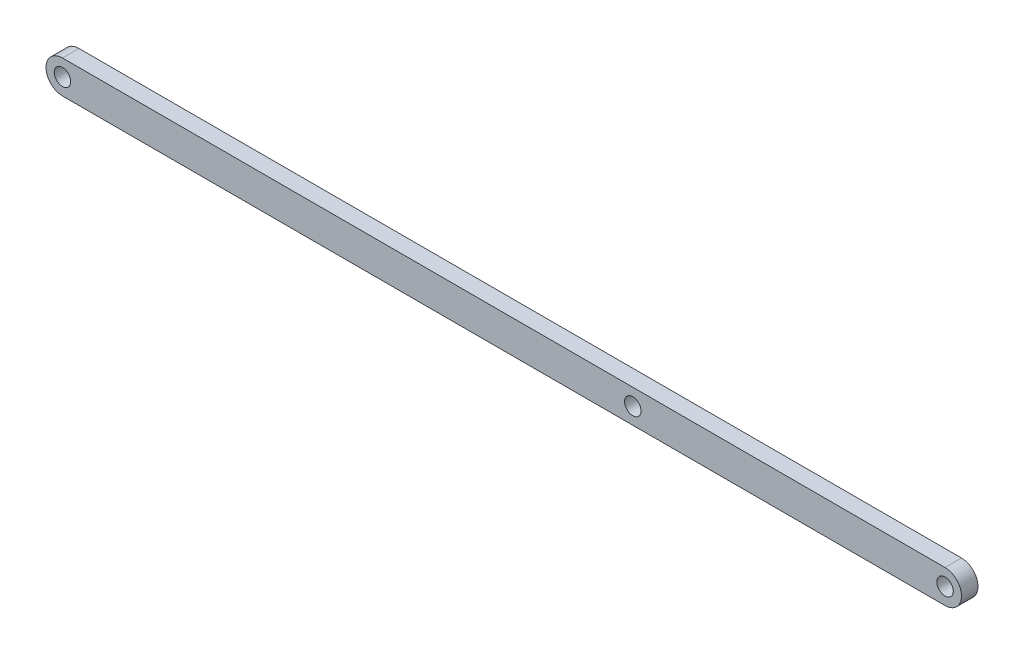
ISO-10303-21;
HEADER;
FILE_DESCRIPTION(('STEP AP214'),'2;1');
FILE_NAME('part.step','',(''),(''),'','','');
FILE_SCHEMA(('AUTOMOTIVE_DESIGN { 1 0 10303 214 1 1 1 1 }'));
ENDSEC;
DATA;
#1=APPLICATION_CONTEXT('core data for automotive mechanical design processes');
#2=APPLICATION_PROTOCOL_DEFINITION('international standard','automotive_design',2000,#1);
#3=PRODUCT_CONTEXT('',#1,'mechanical');
#4=PRODUCT('Part','Part','',(#3));
#5=PRODUCT_RELATED_PRODUCT_CATEGORY('part','',(#4));
#6=PRODUCT_DEFINITION_FORMATION('','',#4);
#7=PRODUCT_DEFINITION_CONTEXT('part definition',#1,'design');
#8=PRODUCT_DEFINITION('design','',#6,#7);
#9=PRODUCT_DEFINITION_SHAPE('','',#8);
#10=(LENGTH_UNIT() NAMED_UNIT(*) SI_UNIT(.MILLI.,.METRE.));
#11=(NAMED_UNIT(*) PLANE_ANGLE_UNIT() SI_UNIT($,.RADIAN.));
#12=(NAMED_UNIT(*) SI_UNIT($,.STERADIAN.) SOLID_ANGLE_UNIT());
#13=UNCERTAINTY_MEASURE_WITH_UNIT(LENGTH_MEASURE(1.E-05),#10,'distance_accuracy_value','');
#14=(GEOMETRIC_REPRESENTATION_CONTEXT(3) GLOBAL_UNCERTAINTY_ASSIGNED_CONTEXT((#13)) GLOBAL_UNIT_ASSIGNED_CONTEXT((#10,
#11,#12)) REPRESENTATION_CONTEXT('',''));
#15=CARTESIAN_POINT('',(0.,0.,0.));
#16=DIRECTION('',(0.,0.,1.));
#17=DIRECTION('',(1.,0.,0.));
#18=AXIS2_PLACEMENT_3D('',#15,#16,#17);
#19=CARTESIAN_POINT('',(40.72,0.,5.));
#20=DIRECTION('',(0.,0.,-1.));
#21=DIRECTION('',(-1.,0.,0.));
#22=AXIS2_PLACEMENT_3D('',#19,#20,#21);
#23=PLANE('',#22);
#24=CARTESIAN_POINT('',(40.72,0.,5.));
#25=DIRECTION('',(0.,0.,1.));
#26=DIRECTION('',(-1.,0.,0.));
#27=AXIS2_PLACEMENT_3D('',#24,#25,#26);
#28=CIRCLE('',#27,5.);
#29=CARTESIAN_POINT('',(40.72,-5.,5.));
#30=VERTEX_POINT('',#29);
#31=CARTESIAN_POINT('',(40.72,5.,5.));
#32=VERTEX_POINT('',#31);
#33=EDGE_CURVE('E96',#30,#32,#28,.T.);
#34=ORIENTED_EDGE('',*,*,#33,.T.);
#35=DIRECTION('',(-1.,0.,0.));
#36=VECTOR('',#35,1.);
#37=CARTESIAN_POINT('',(-227.28,5.,5.));
#38=LINE('',#37,#36);
#39=CARTESIAN_POINT('',(-227.28,5.,5.));
#40=VERTEX_POINT('',#39);
#41=EDGE_CURVE('E91',#32,#40,#38,.T.);
#42=ORIENTED_EDGE('',*,*,#41,.T.);
#43=CARTESIAN_POINT('',(-227.28,0.,5.));
#44=DIRECTION('',(0.,0.,1.));
#45=DIRECTION('',(1.,0.,0.));
#46=AXIS2_PLACEMENT_3D('',#43,#44,#45);
#47=CIRCLE('',#46,5.);
#48=CARTESIAN_POINT('',(-227.28,-5.,5.));
#49=VERTEX_POINT('',#48);
#50=EDGE_CURVE('E94',#40,#49,#47,.T.);
#51=ORIENTED_EDGE('',*,*,#50,.T.);
#52=DIRECTION('',(1.,0.,0.));
#53=VECTOR('',#52,1.);
#54=CARTESIAN_POINT('',(-227.28,-5.,5.));
#55=LINE('',#54,#53);
#56=EDGE_CURVE('E61',#49,#30,#55,.T.);
#57=ORIENTED_EDGE('',*,*,#56,.T.);
#58=EDGE_LOOP('',(#34,#42,#51,#57));
#59=FACE_BOUND('',#58,.T.);
#60=CARTESIAN_POINT('',(-54.1,0.,5.));
#61=DIRECTION('',(0.,0.,1.));
#62=DIRECTION('',(1.,0.,0.));
#63=AXIS2_PLACEMENT_3D('',#60,#61,#62);
#64=CIRCLE('',#63,2.5);
#65=CARTESIAN_POINT('',(-51.6,0.,5.));
#66=VERTEX_POINT('',#65);
#67=EDGE_CURVE('E116',#66,#66,#64,.T.);
#68=ORIENTED_EDGE('',*,*,#67,.F.);
#69=EDGE_LOOP('',(#68));
#70=FACE_BOUND('',#69,.T.);
#71=CARTESIAN_POINT('',(-227.28,0.,5.));
#72=DIRECTION('',(0.,0.,1.));
#73=DIRECTION('',(1.,0.,0.));
#74=AXIS2_PLACEMENT_3D('',#71,#72,#73);
#75=CIRCLE('',#74,2.5);
#76=CARTESIAN_POINT('',(-224.78,0.,5.));
#77=VERTEX_POINT('',#76);
#78=EDGE_CURVE('E138',#77,#77,#75,.T.);
#79=ORIENTED_EDGE('',*,*,#78,.F.);
#80=EDGE_LOOP('',(#79));
#81=FACE_BOUND('',#80,.T.);
#82=CARTESIAN_POINT('',(40.72,0.,5.));
#83=DIRECTION('',(0.,0.,1.));
#84=DIRECTION('',(1.,0.,0.));
#85=AXIS2_PLACEMENT_3D('',#82,#83,#84);
#86=CIRCLE('',#85,2.49999999999999);
#87=CARTESIAN_POINT('',(43.22,0.,5.));
#88=VERTEX_POINT('',#87);
#89=EDGE_CURVE('E146',#88,#88,#86,.T.);
#90=ORIENTED_EDGE('',*,*,#89,.F.);
#91=EDGE_LOOP('',(#90));
#92=FACE_BOUND('',#91,.T.);
#93=ADVANCED_FACE('F43',(#59,#70,#81,#92),#23,.F.);
#94=CARTESIAN_POINT('',(40.72,0.,0.));
#95=DIRECTION('',(0.,0.,-1.));
#96=DIRECTION('',(-1.,0.,0.));
#97=AXIS2_PLACEMENT_3D('',#94,#95,#96);
#98=PLANE('',#97);
#99=CARTESIAN_POINT('',(-227.28,0.,0.));
#100=DIRECTION('',(0.,0.,1.));
#101=DIRECTION('',(1.,0.,0.));
#102=AXIS2_PLACEMENT_3D('',#99,#100,#101);
#103=CIRCLE('',#102,2.5);
#104=CARTESIAN_POINT('',(-224.78,0.,0.));
#105=VERTEX_POINT('',#104);
#106=EDGE_CURVE('E142',#105,#105,#103,.T.);
#107=ORIENTED_EDGE('',*,*,#106,.T.);
#108=EDGE_LOOP('',(#107));
#109=FACE_BOUND('',#108,.T.);
#110=CARTESIAN_POINT('',(40.72,0.,0.));
#111=DIRECTION('',(0.,0.,1.));
#112=DIRECTION('',(-1.,0.,0.));
#113=AXIS2_PLACEMENT_3D('',#110,#111,#112);
#114=CIRCLE('',#113,5.);
#115=CARTESIAN_POINT('',(40.72,-5.,0.));
#116=VERTEX_POINT('',#115);
#117=CARTESIAN_POINT('',(40.72,5.,0.));
#118=VERTEX_POINT('',#117);
#119=EDGE_CURVE('E112',#116,#118,#114,.T.);
#120=ORIENTED_EDGE('',*,*,#119,.F.);
#121=DIRECTION('',(1.,0.,0.));
#122=VECTOR('',#121,1.);
#123=CARTESIAN_POINT('',(-227.28,-5.,0.));
#124=LINE('',#123,#122);
#125=CARTESIAN_POINT('',(-227.28,-5.,0.));
#126=VERTEX_POINT('',#125);
#127=EDGE_CURVE('E84',#126,#116,#124,.T.);
#128=ORIENTED_EDGE('',*,*,#127,.F.);
#129=CARTESIAN_POINT('',(-227.28,0.,0.));
#130=DIRECTION('',(0.,0.,1.));
#131=DIRECTION('',(1.,0.,0.));
#132=AXIS2_PLACEMENT_3D('',#129,#130,#131);
#133=CIRCLE('',#132,5.);
#134=CARTESIAN_POINT('',(-227.28,5.,0.));
#135=VERTEX_POINT('',#134);
#136=EDGE_CURVE('E78',#135,#126,#133,.T.);
#137=ORIENTED_EDGE('',*,*,#136,.F.);
#138=DIRECTION('',(-1.,0.,0.));
#139=VECTOR('',#138,1.);
#140=CARTESIAN_POINT('',(-227.28,5.,0.));
#141=LINE('',#140,#139);
#142=EDGE_CURVE('E101',#118,#135,#141,.T.);
#143=ORIENTED_EDGE('',*,*,#142,.F.);
#144=EDGE_LOOP('',(#120,#128,#137,#143));
#145=FACE_BOUND('',#144,.T.);
#146=CARTESIAN_POINT('',(-54.1,0.,0.));
#147=DIRECTION('',(0.,0.,1.));
#148=DIRECTION('',(1.,0.,0.));
#149=AXIS2_PLACEMENT_3D('',#146,#147,#148);
#150=CIRCLE('',#149,2.5);
#151=CARTESIAN_POINT('',(-51.6,0.,0.));
#152=VERTEX_POINT('',#151);
#153=EDGE_CURVE('E134',#152,#152,#150,.T.);
#154=ORIENTED_EDGE('',*,*,#153,.T.);
#155=EDGE_LOOP('',(#154));
#156=FACE_BOUND('',#155,.T.);
#157=CARTESIAN_POINT('',(40.72,0.,0.));
#158=DIRECTION('',(0.,0.,1.));
#159=DIRECTION('',(1.,0.,0.));
#160=AXIS2_PLACEMENT_3D('',#157,#158,#159);
#161=CIRCLE('',#160,2.49999999999999);
#162=CARTESIAN_POINT('',(43.22,0.,0.));
#163=VERTEX_POINT('',#162);
#164=EDGE_CURVE('E150',#163,#163,#161,.T.);
#165=ORIENTED_EDGE('',*,*,#164,.T.);
#166=EDGE_LOOP('',(#165));
#167=FACE_BOUND('',#166,.T.);
#168=ADVANCED_FACE('F129',(#109,#145,#156,#167),#98,.T.);
#169=CARTESIAN_POINT('',(40.72,0.,5.));
#170=DIRECTION('',(0.,0.,-1.));
#171=DIRECTION('',(-1.,0.,0.));
#172=AXIS2_PLACEMENT_3D('',#169,#170,#171);
#173=CYLINDRICAL_SURFACE('',#172,5.);
#174=ORIENTED_EDGE('',*,*,#119,.T.);
#175=DIRECTION('',(0.,0.,-1.));
#176=VECTOR('',#175,1.);
#177=CARTESIAN_POINT('',(40.72,5.,5.));
#178=LINE('',#177,#176);
#179=EDGE_CURVE('E11',#32,#118,#178,.T.);
#180=ORIENTED_EDGE('',*,*,#179,.F.);
#181=ORIENTED_EDGE('',*,*,#33,.F.);
#182=DIRECTION('',(0.,0.,-1.));
#183=VECTOR('',#182,1.);
#184=CARTESIAN_POINT('',(40.72,-5.,5.));
#185=LINE('',#184,#183);
#186=EDGE_CURVE('E108',#30,#116,#185,.T.);
#187=ORIENTED_EDGE('',*,*,#186,.T.);
#188=EDGE_LOOP('',(#174,#180,#181,#187));
#189=FACE_BOUND('',#188,.T.);
#190=ADVANCED_FACE('F45',(#189),#173,.T.);
#191=CARTESIAN_POINT('',(-227.28,5.,5.));
#192=DIRECTION('',(0.,-1.,0.));
#193=DIRECTION('',(0.,0.,-1.));
#194=AXIS2_PLACEMENT_3D('',#191,#192,#193);
#195=PLANE('',#194);
#196=ORIENTED_EDGE('',*,*,#142,.T.);
#197=DIRECTION('',(0.,0.,-1.));
#198=VECTOR('',#197,1.);
#199=CARTESIAN_POINT('',(-227.28,5.,5.));
#200=LINE('',#199,#198);
#201=EDGE_CURVE('E53',#40,#135,#200,.T.);
#202=ORIENTED_EDGE('',*,*,#201,.F.);
#203=ORIENTED_EDGE('',*,*,#41,.F.);
#204=ORIENTED_EDGE('',*,*,#179,.T.);
#205=EDGE_LOOP('',(#196,#202,#203,#204));
#206=FACE_BOUND('',#205,.T.);
#207=ADVANCED_FACE('F100',(#206),#195,.F.);
#208=CARTESIAN_POINT('',(-227.28,0.,5.));
#209=DIRECTION('',(0.,0.,-1.));
#210=DIRECTION('',(-1.,0.,0.));
#211=AXIS2_PLACEMENT_3D('',#208,#209,#210);
#212=CYLINDRICAL_SURFACE('',#211,5.);
#213=ORIENTED_EDGE('',*,*,#136,.T.);
#214=DIRECTION('',(0.,0.,-1.));
#215=VECTOR('',#214,1.);
#216=CARTESIAN_POINT('',(-227.28,-5.,5.));
#217=LINE('',#216,#215);
#218=EDGE_CURVE('E103',#49,#126,#217,.T.);
#219=ORIENTED_EDGE('',*,*,#218,.F.);
#220=ORIENTED_EDGE('',*,*,#50,.F.);
#221=ORIENTED_EDGE('',*,*,#201,.T.);
#222=EDGE_LOOP('',(#213,#219,#220,#221));
#223=FACE_BOUND('',#222,.T.);
#224=ADVANCED_FACE('F104',(#223),#212,.T.);
#225=CARTESIAN_POINT('',(-227.28,-5.,5.));
#226=DIRECTION('',(0.,1.,0.));
#227=DIRECTION('',(0.,0.,1.));
#228=AXIS2_PLACEMENT_3D('',#225,#226,#227);
#229=PLANE('',#228);
#230=ORIENTED_EDGE('',*,*,#127,.T.);
#231=ORIENTED_EDGE('',*,*,#186,.F.);
#232=ORIENTED_EDGE('',*,*,#56,.F.);
#233=ORIENTED_EDGE('',*,*,#218,.T.);
#234=EDGE_LOOP('',(#230,#231,#232,#233));
#235=FACE_BOUND('',#234,.T.);
#236=ADVANCED_FACE('F126',(#235),#229,.F.);
#237=CARTESIAN_POINT('',(-54.1,0.,5.));
#238=DIRECTION('',(0.,0.,-1.));
#239=DIRECTION('',(-1.,0.,0.));
#240=AXIS2_PLACEMENT_3D('',#237,#238,#239);
#241=CYLINDRICAL_SURFACE('',#240,2.5);
#242=ORIENTED_EDGE('',*,*,#67,.T.);
#243=EDGE_LOOP('',(#242));
#244=FACE_BOUND('',#243,.T.);
#245=ORIENTED_EDGE('',*,*,#153,.F.);
#246=EDGE_LOOP('',(#245));
#247=FACE_BOUND('',#246,.T.);
#248=ADVANCED_FACE('F169',(#244,#247),#241,.F.);
#249=CARTESIAN_POINT('',(-227.28,0.,5.));
#250=DIRECTION('',(0.,0.,-1.));
#251=DIRECTION('',(-1.,0.,0.));
#252=AXIS2_PLACEMENT_3D('',#249,#250,#251);
#253=CYLINDRICAL_SURFACE('',#252,2.5);
#254=ORIENTED_EDGE('',*,*,#78,.T.);
#255=EDGE_LOOP('',(#254));
#256=FACE_BOUND('',#255,.T.);
#257=ORIENTED_EDGE('',*,*,#106,.F.);
#258=EDGE_LOOP('',(#257));
#259=FACE_BOUND('',#258,.T.);
#260=ADVANCED_FACE('F223',(#256,#259),#253,.F.);
#261=CARTESIAN_POINT('',(40.72,0.,5.));
#262=DIRECTION('',(0.,0.,-1.));
#263=DIRECTION('',(-1.,0.,0.));
#264=AXIS2_PLACEMENT_3D('',#261,#262,#263);
#265=CYLINDRICAL_SURFACE('',#264,2.49999999999999);
#266=ORIENTED_EDGE('',*,*,#89,.T.);
#267=EDGE_LOOP('',(#266));
#268=FACE_BOUND('',#267,.T.);
#269=ORIENTED_EDGE('',*,*,#164,.F.);
#270=EDGE_LOOP('',(#269));
#271=FACE_BOUND('',#270,.T.);
#272=ADVANCED_FACE('F158',(#268,#271),#265,.F.);
#273=CLOSED_SHELL('',(#93,#168,#190,#207,#224,#236,#248,#260,#272));
#274=MANIFOLD_SOLID_BREP('B2',#273);
#275=ADVANCED_BREP_SHAPE_REPRESENTATION('',(#18,#274),#14);
#276=SHAPE_DEFINITION_REPRESENTATION(#9,#275);
ENDSEC;
END-ISO-10303-21;
